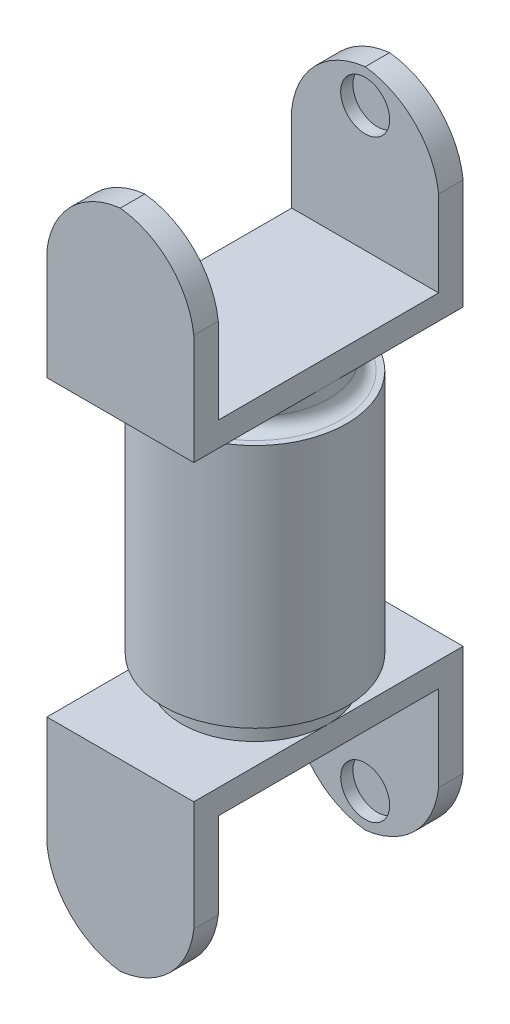
ISO-10303-21;
HEADER;
FILE_DESCRIPTION(('STEP AP214'),'2;1');
FILE_NAME('part.step','',(''),(''),'','','');
FILE_SCHEMA(('AUTOMOTIVE_DESIGN { 1 0 10303 214 1 1 1 1 }'));
ENDSEC;
DATA;
#1=APPLICATION_CONTEXT('core data for automotive mechanical design processes');
#2=APPLICATION_PROTOCOL_DEFINITION('international standard','automotive_design',2000,#1);
#3=PRODUCT_CONTEXT('',#1,'mechanical');
#4=PRODUCT('Part','Part','',(#3));
#5=PRODUCT_RELATED_PRODUCT_CATEGORY('part','',(#4));
#6=PRODUCT_DEFINITION_FORMATION('','',#4);
#7=PRODUCT_DEFINITION_CONTEXT('part definition',#1,'design');
#8=PRODUCT_DEFINITION('design','',#6,#7);
#9=PRODUCT_DEFINITION_SHAPE('','',#8);
#10=(LENGTH_UNIT() NAMED_UNIT(*) SI_UNIT(.MILLI.,.METRE.));
#11=(NAMED_UNIT(*) PLANE_ANGLE_UNIT() SI_UNIT($,.RADIAN.));
#12=(NAMED_UNIT(*) SI_UNIT($,.STERADIAN.) SOLID_ANGLE_UNIT());
#13=UNCERTAINTY_MEASURE_WITH_UNIT(LENGTH_MEASURE(1.E-05),#10,'distance_accuracy_value','');
#14=(GEOMETRIC_REPRESENTATION_CONTEXT(3) GLOBAL_UNCERTAINTY_ASSIGNED_CONTEXT((#13)) GLOBAL_UNIT_ASSIGNED_CONTEXT((#10,
#11,#12)) REPRESENTATION_CONTEXT('',''));
#15=CARTESIAN_POINT('',(0.,0.,0.));
#16=DIRECTION('',(0.,0.,1.));
#17=DIRECTION('',(1.,0.,0.));
#18=AXIS2_PLACEMENT_3D('',#15,#16,#17);
#19=CARTESIAN_POINT('',(-6.,-12.,-11.));
#20=DIRECTION('',(0.,0.,1.));
#21=DIRECTION('',(1.,0.,0.));
#22=AXIS2_PLACEMENT_3D('',#19,#20,#21);
#23=PLANE('',#22);
#24=CARTESIAN_POINT('',(-0.750000000000014,-20.25,-11.));
#25=DIRECTION('',(0.,0.,1.));
#26=DIRECTION('',(1.,0.,0.));
#27=AXIS2_PLACEMENT_3D('',#24,#25,#26);
#28=CIRCLE('',#27,6.79153885360307);
#29=CARTESIAN_POINT('',(0.,-27.,-11.));
#30=VERTEX_POINT('',#29);
#31=CARTESIAN_POINT('',(6.,-21.,-11.));
#32=VERTEX_POINT('',#31);
#33=EDGE_CURVE('E519',#30,#32,#28,.T.);
#34=ORIENTED_EDGE('',*,*,#33,.F.);
#35=CARTESIAN_POINT('',(0.750000000000014,-20.25,-11.));
#36=DIRECTION('',(0.,0.,1.));
#37=DIRECTION('',(1.,0.,0.));
#38=AXIS2_PLACEMENT_3D('',#35,#36,#37);
#39=CIRCLE('',#38,6.79153885360307);
#40=CARTESIAN_POINT('',(-6.,-21.,-11.));
#41=VERTEX_POINT('',#40);
#42=EDGE_CURVE('E502',#30,#41,#39,.F.);
#43=ORIENTED_EDGE('',*,*,#42,.T.);
#44=DIRECTION('',(0.,-1.,0.));
#45=VECTOR('',#44,1.);
#46=CARTESIAN_POINT('',(-6.,-12.,-11.));
#47=LINE('',#46,#45);
#48=CARTESIAN_POINT('',(-6.,-12.,-11.));
#49=VERTEX_POINT('',#48);
#50=EDGE_CURVE('E291',#49,#41,#47,.T.);
#51=ORIENTED_EDGE('',*,*,#50,.F.);
#52=DIRECTION('',(1.,0.,0.));
#53=VECTOR('',#52,1.);
#54=CARTESIAN_POINT('',(-6.,-12.,-11.));
#55=LINE('',#54,#53);
#56=CARTESIAN_POINT('',(6.,-12.,-11.));
#57=VERTEX_POINT('',#56);
#58=EDGE_CURVE('E296',#49,#57,#55,.T.);
#59=ORIENTED_EDGE('',*,*,#58,.T.);
#60=DIRECTION('',(0.,-1.,0.));
#61=VECTOR('',#60,1.);
#62=CARTESIAN_POINT('',(6.,-12.,-11.));
#63=LINE('',#62,#61);
#64=EDGE_CURVE('E269',#57,#32,#63,.T.);
#65=ORIENTED_EDGE('',*,*,#64,.T.);
#66=EDGE_LOOP('',(#34,#43,#51,#59,#65));
#67=FACE_BOUND('',#66,.T.);
#68=ADVANCED_FACE('F75',(#67),#23,.F.);
#69=CARTESIAN_POINT('',(-6.,-27.,-9.));
#70=DIRECTION('',(0.,0.,-1.));
#71=DIRECTION('',(-1.,0.,0.));
#72=AXIS2_PLACEMENT_3D('',#69,#70,#71);
#73=PLANE('',#72);
#74=CARTESIAN_POINT('',(0.,-24.25,-9.));
#75=DIRECTION('',(0.,0.,-1.));
#76=DIRECTION('',(-1.,0.,0.));
#77=AXIS2_PLACEMENT_3D('',#74,#75,#76);
#78=CIRCLE('',#77,2.);
#79=CARTESIAN_POINT('',(-2.,-24.25,-9.));
#80=VERTEX_POINT('',#79);
#81=EDGE_CURVE('E246',#80,#80,#78,.T.);
#82=ORIENTED_EDGE('',*,*,#81,.T.);
#83=EDGE_LOOP('',(#82));
#84=FACE_BOUND('',#83,.T.);
#85=CARTESIAN_POINT('',(-0.750000000000014,-20.25,-9.));
#86=DIRECTION('',(0.,0.,-1.));
#87=DIRECTION('',(-1.,0.,0.));
#88=AXIS2_PLACEMENT_3D('',#85,#86,#87);
#89=CIRCLE('',#88,6.79153885360307);
#90=CARTESIAN_POINT('',(6.,-21.,-9.));
#91=VERTEX_POINT('',#90);
#92=CARTESIAN_POINT('',(0.,-27.,-9.));
#93=VERTEX_POINT('',#92);
#94=EDGE_CURVE('E522',#91,#93,#89,.T.);
#95=ORIENTED_EDGE('',*,*,#94,.F.);
#96=DIRECTION('',(0.,1.,0.));
#97=VECTOR('',#96,1.);
#98=CARTESIAN_POINT('',(6.,-27.,-9.));
#99=LINE('',#98,#97);
#100=CARTESIAN_POINT('',(6.,-14.,-9.));
#101=VERTEX_POINT('',#100);
#102=EDGE_CURVE('E266',#91,#101,#99,.T.);
#103=ORIENTED_EDGE('',*,*,#102,.T.);
#104=DIRECTION('',(1.,0.,0.));
#105=VECTOR('',#104,1.);
#106=CARTESIAN_POINT('',(-6.,-14.,-9.));
#107=LINE('',#106,#105);
#108=CARTESIAN_POINT('',(-6.,-14.,-9.));
#109=VERTEX_POINT('',#108);
#110=EDGE_CURVE('E301',#109,#101,#107,.T.);
#111=ORIENTED_EDGE('',*,*,#110,.F.);
#112=DIRECTION('',(0.,1.,0.));
#113=VECTOR('',#112,1.);
#114=CARTESIAN_POINT('',(-6.,-27.,-9.));
#115=LINE('',#114,#113);
#116=CARTESIAN_POINT('',(-6.,-21.,-9.));
#117=VERTEX_POINT('',#116);
#118=EDGE_CURVE('E288',#117,#109,#115,.T.);
#119=ORIENTED_EDGE('',*,*,#118,.F.);
#120=CARTESIAN_POINT('',(0.750000000000014,-20.25,-9.));
#121=DIRECTION('',(0.,0.,-1.));
#122=DIRECTION('',(-1.,0.,0.));
#123=AXIS2_PLACEMENT_3D('',#120,#121,#122);
#124=CIRCLE('',#123,6.79153885360307);
#125=EDGE_CURVE('E100',#117,#93,#124,.F.);
#126=ORIENTED_EDGE('',*,*,#125,.T.);
#127=EDGE_LOOP('',(#95,#103,#111,#119,#126));
#128=FACE_BOUND('',#127,.T.);
#129=ADVANCED_FACE('F555',(#84,#128),#73,.F.);
#130=CARTESIAN_POINT('',(-6.,-14.,9.));
#131=DIRECTION('',(0.,0.,1.));
#132=DIRECTION('',(0.,-1.,0.));
#133=AXIS2_PLACEMENT_3D('',#130,#131,#132);
#134=PLANE('',#133);
#135=CARTESIAN_POINT('',(0.,-24.25,9.));
#136=DIRECTION('',(0.,0.,1.));
#137=DIRECTION('',(0.,-1.,0.));
#138=AXIS2_PLACEMENT_3D('',#135,#136,#137);
#139=CIRCLE('',#138,2.);
#140=CARTESIAN_POINT('',(0.,-26.25,9.));
#141=VERTEX_POINT('',#140);
#142=EDGE_CURVE('E79',#141,#141,#139,.T.);
#143=ORIENTED_EDGE('',*,*,#142,.T.);
#144=EDGE_LOOP('',(#143));
#145=FACE_BOUND('',#144,.T.);
#146=CARTESIAN_POINT('',(-0.750000000000014,-20.25,9.));
#147=DIRECTION('',(0.,0.,1.));
#148=DIRECTION('',(0.,-1.,0.));
#149=AXIS2_PLACEMENT_3D('',#146,#147,#148);
#150=CIRCLE('',#149,6.79153885360307);
#151=CARTESIAN_POINT('',(0.,-27.,9.));
#152=VERTEX_POINT('',#151);
#153=CARTESIAN_POINT('',(6.,-21.,9.));
#154=VERTEX_POINT('',#153);
#155=EDGE_CURVE('E231',#152,#154,#150,.T.);
#156=ORIENTED_EDGE('',*,*,#155,.F.);
#157=CARTESIAN_POINT('',(0.750000000000014,-20.25,9.));
#158=DIRECTION('',(0.,0.,1.));
#159=DIRECTION('',(0.,-1.,0.));
#160=AXIS2_PLACEMENT_3D('',#157,#158,#159);
#161=CIRCLE('',#160,6.79153885360307);
#162=CARTESIAN_POINT('',(-6.,-21.,9.));
#163=VERTEX_POINT('',#162);
#164=EDGE_CURVE('E507',#152,#163,#161,.F.);
#165=ORIENTED_EDGE('',*,*,#164,.T.);
#166=DIRECTION('',(0.,-1.,0.));
#167=VECTOR('',#166,1.);
#168=CARTESIAN_POINT('',(-6.,-14.,9.));
#169=LINE('',#168,#167);
#170=CARTESIAN_POINT('',(-6.,-14.,9.));
#171=VERTEX_POINT('',#170);
#172=EDGE_CURVE('E281',#171,#163,#169,.T.);
#173=ORIENTED_EDGE('',*,*,#172,.F.);
#174=DIRECTION('',(1.,0.,0.));
#175=VECTOR('',#174,1.);
#176=CARTESIAN_POINT('',(-6.,-14.,9.));
#177=LINE('',#176,#175);
#178=CARTESIAN_POINT('',(6.,-14.,9.));
#179=VERTEX_POINT('',#178);
#180=EDGE_CURVE('E305',#171,#179,#177,.T.);
#181=ORIENTED_EDGE('',*,*,#180,.T.);
#182=DIRECTION('',(0.,-1.,0.));
#183=VECTOR('',#182,1.);
#184=CARTESIAN_POINT('',(6.,-14.,9.));
#185=LINE('',#184,#183);
#186=EDGE_CURVE('E253',#179,#154,#185,.T.);
#187=ORIENTED_EDGE('',*,*,#186,.T.);
#188=EDGE_LOOP('',(#156,#165,#173,#181,#187));
#189=FACE_BOUND('',#188,.T.);
#190=ADVANCED_FACE('F560',(#145,#189),#134,.F.);
#191=CARTESIAN_POINT('',(-6.,-27.,11.));
#192=DIRECTION('',(0.,0.,-1.));
#193=DIRECTION('',(0.,1.,0.));
#194=AXIS2_PLACEMENT_3D('',#191,#192,#193);
#195=PLANE('',#194);
#196=CARTESIAN_POINT('',(-0.750000000000014,-20.25,11.));
#197=DIRECTION('',(0.,0.,-1.));
#198=DIRECTION('',(1.,0.,0.));
#199=AXIS2_PLACEMENT_3D('',#196,#197,#198);
#200=CIRCLE('',#199,6.79153885360307);
#201=CARTESIAN_POINT('',(0.,-27.,11.));
#202=VERTEX_POINT('',#201);
#203=CARTESIAN_POINT('',(6.,-21.,11.));
#204=VERTEX_POINT('',#203);
#205=EDGE_CURVE('E229',#202,#204,#200,.F.);
#206=ORIENTED_EDGE('',*,*,#205,.T.);
#207=DIRECTION('',(0.,1.,0.));
#208=VECTOR('',#207,1.);
#209=CARTESIAN_POINT('',(6.,-27.,11.));
#210=LINE('',#209,#208);
#211=CARTESIAN_POINT('',(6.,-12.,11.));
#212=VERTEX_POINT('',#211);
#213=EDGE_CURVE('E242',#204,#212,#210,.T.);
#214=ORIENTED_EDGE('',*,*,#213,.T.);
#215=DIRECTION('',(1.,0.,0.));
#216=VECTOR('',#215,1.);
#217=CARTESIAN_POINT('',(-6.,-12.,11.));
#218=LINE('',#217,#216);
#219=CARTESIAN_POINT('',(-6.,-12.,11.));
#220=VERTEX_POINT('',#219);
#221=EDGE_CURVE('E295',#220,#212,#218,.T.);
#222=ORIENTED_EDGE('',*,*,#221,.F.);
#223=DIRECTION('',(0.,1.,0.));
#224=VECTOR('',#223,1.);
#225=CARTESIAN_POINT('',(-6.,-27.,11.));
#226=LINE('',#225,#224);
#227=CARTESIAN_POINT('',(-6.,-21.,11.));
#228=VERTEX_POINT('',#227);
#229=EDGE_CURVE('E278',#228,#220,#226,.T.);
#230=ORIENTED_EDGE('',*,*,#229,.F.);
#231=CARTESIAN_POINT('',(0.750000000000014,-20.25,11.));
#232=DIRECTION('',(0.,0.,-1.));
#233=DIRECTION('',(1.,0.,0.));
#234=AXIS2_PLACEMENT_3D('',#231,#232,#233);
#235=CIRCLE('',#234,6.79153885360307);
#236=EDGE_CURVE('E92',#202,#228,#235,.T.);
#237=ORIENTED_EDGE('',*,*,#236,.F.);
#238=EDGE_LOOP('',(#206,#214,#222,#230,#237));
#239=FACE_BOUND('',#238,.T.);
#240=ADVANCED_FACE('F240',(#239),#195,.F.);
#241=CARTESIAN_POINT('',(6.,0.,0.));
#242=DIRECTION('',(1.,0.,0.));
#243=DIRECTION('',(0.,0.,-1.));
#244=AXIS2_PLACEMENT_3D('',#241,#242,#243);
#245=PLANE('',#244);
#246=ORIENTED_EDGE('',*,*,#213,.F.);
#247=DIRECTION('',(0.,0.,1.));
#248=VECTOR('',#247,1.);
#249=CARTESIAN_POINT('',(6.,-21.,-18.));
#250=LINE('',#249,#248);
#251=EDGE_CURVE('E226',#154,#204,#250,.T.);
#252=ORIENTED_EDGE('',*,*,#251,.F.);
#253=ORIENTED_EDGE('',*,*,#186,.F.);
#254=DIRECTION('',(0.,0.,1.));
#255=VECTOR('',#254,1.);
#256=CARTESIAN_POINT('',(6.,-14.,-9.));
#257=LINE('',#256,#255);
#258=EDGE_CURVE('E257',#101,#179,#257,.T.);
#259=ORIENTED_EDGE('',*,*,#258,.F.);
#260=ORIENTED_EDGE('',*,*,#102,.F.);
#261=EDGE_CURVE('E237',#32,#91,#250,.T.);
#262=ORIENTED_EDGE('',*,*,#261,.F.);
#263=ORIENTED_EDGE('',*,*,#64,.F.);
#264=DIRECTION('',(0.,0.,-1.));
#265=VECTOR('',#264,1.);
#266=CARTESIAN_POINT('',(6.,-12.,-6.));
#267=LINE('',#266,#265);
#268=CARTESIAN_POINT('',(6.,-12.,0.));
#269=VERTEX_POINT('',#268);
#270=EDGE_CURVE('E259',#269,#57,#267,.T.);
#271=ORIENTED_EDGE('',*,*,#270,.F.);
#272=EDGE_CURVE('E251',#212,#269,#267,.T.);
#273=ORIENTED_EDGE('',*,*,#272,.F.);
#274=EDGE_LOOP('',(#246,#252,#253,#259,#260,#262,#263,#271,#273));
#275=FACE_BOUND('',#274,.T.);
#276=ADVANCED_FACE('F249',(#275),#245,.T.);
#277=CARTESIAN_POINT('',(-6.,27.,11.));
#278=DIRECTION('',(0.,0.,1.));
#279=DIRECTION('',(0.,-1.,0.));
#280=AXIS2_PLACEMENT_3D('',#277,#278,#279);
#281=PLANE('',#280);
#282=CARTESIAN_POINT('',(-0.750000000000014,20.25,11.));
#283=DIRECTION('',(0.,0.,1.));
#284=DIRECTION('',(1.,0.,0.));
#285=AXIS2_PLACEMENT_3D('',#282,#283,#284);
#286=CIRCLE('',#285,6.79153885360307);
#287=CARTESIAN_POINT('',(0.,27.,11.));
#288=VERTEX_POINT('',#287);
#289=CARTESIAN_POINT('',(6.,21.,11.));
#290=VERTEX_POINT('',#289);
#291=EDGE_CURVE('E335',#288,#290,#286,.F.);
#292=ORIENTED_EDGE('',*,*,#291,.F.);
#293=CARTESIAN_POINT('',(0.750000000000014,20.25,11.));
#294=DIRECTION('',(0.,0.,1.));
#295=DIRECTION('',(1.,0.,0.));
#296=AXIS2_PLACEMENT_3D('',#293,#294,#295);
#297=CIRCLE('',#296,6.79153885360307);
#298=CARTESIAN_POINT('',(-6.,21.,11.));
#299=VERTEX_POINT('',#298);
#300=EDGE_CURVE('E352',#288,#299,#297,.T.);
#301=ORIENTED_EDGE('',*,*,#300,.T.);
#302=DIRECTION('',(0.,-1.,0.));
#303=VECTOR('',#302,1.);
#304=CARTESIAN_POINT('',(-6.,27.,11.));
#305=LINE('',#304,#303);
#306=CARTESIAN_POINT('',(-6.,12.,11.));
#307=VERTEX_POINT('',#306);
#308=EDGE_CURVE('E415',#299,#307,#305,.T.);
#309=ORIENTED_EDGE('',*,*,#308,.T.);
#310=DIRECTION('',(1.,0.,0.));
#311=VECTOR('',#310,1.);
#312=CARTESIAN_POINT('',(-6.,12.,11.));
#313=LINE('',#312,#311);
#314=CARTESIAN_POINT('',(6.,12.,11.));
#315=VERTEX_POINT('',#314);
#316=EDGE_CURVE('E419',#307,#315,#313,.T.);
#317=ORIENTED_EDGE('',*,*,#316,.T.);
#318=DIRECTION('',(0.,-1.,0.));
#319=VECTOR('',#318,1.);
#320=CARTESIAN_POINT('',(6.,27.,11.));
#321=LINE('',#320,#319);
#322=EDGE_CURVE('E392',#290,#315,#321,.T.);
#323=ORIENTED_EDGE('',*,*,#322,.F.);
#324=EDGE_LOOP('',(#292,#301,#309,#317,#323));
#325=FACE_BOUND('',#324,.T.);
#326=ADVANCED_FACE('F618',(#325),#281,.T.);
#327=CARTESIAN_POINT('',(-6.,14.,9.));
#328=DIRECTION('',(0.,0.,-1.));
#329=DIRECTION('',(0.,1.,0.));
#330=AXIS2_PLACEMENT_3D('',#327,#328,#329);
#331=PLANE('',#330);
#332=CARTESIAN_POINT('',(0.,24.25,9.));
#333=DIRECTION('',(0.,0.,-1.));
#334=DIRECTION('',(0.,1.,0.));
#335=AXIS2_PLACEMENT_3D('',#332,#333,#334);
#336=CIRCLE('',#335,2.);
#337=CARTESIAN_POINT('',(0.,26.25,9.));
#338=VERTEX_POINT('',#337);
#339=EDGE_CURVE('E331',#338,#338,#336,.F.);
#340=ORIENTED_EDGE('',*,*,#339,.T.);
#341=EDGE_LOOP('',(#340));
#342=FACE_BOUND('',#341,.T.);
#343=CARTESIAN_POINT('',(-0.750000000000014,20.25,9.));
#344=DIRECTION('',(0.,0.,-1.));
#345=DIRECTION('',(0.,1.,0.));
#346=AXIS2_PLACEMENT_3D('',#343,#344,#345);
#347=CIRCLE('',#346,6.79153885360307);
#348=CARTESIAN_POINT('',(6.,21.,9.));
#349=VERTEX_POINT('',#348);
#350=CARTESIAN_POINT('',(0.,27.,9.00000000000001));
#351=VERTEX_POINT('',#350);
#352=EDGE_CURVE('E349',#349,#351,#347,.F.);
#353=ORIENTED_EDGE('',*,*,#352,.F.);
#354=DIRECTION('',(0.,1.,0.));
#355=VECTOR('',#354,1.);
#356=CARTESIAN_POINT('',(6.,14.,9.));
#357=LINE('',#356,#355);
#358=CARTESIAN_POINT('',(6.,14.,9.));
#359=VERTEX_POINT('',#358);
#360=EDGE_CURVE('E388',#359,#349,#357,.T.);
#361=ORIENTED_EDGE('',*,*,#360,.F.);
#362=DIRECTION('',(1.,0.,0.));
#363=VECTOR('',#362,1.);
#364=CARTESIAN_POINT('',(-6.,14.,9.));
#365=LINE('',#364,#363);
#366=CARTESIAN_POINT('',(-6.,14.,9.));
#367=VERTEX_POINT('',#366);
#368=EDGE_CURVE('E424',#367,#359,#365,.T.);
#369=ORIENTED_EDGE('',*,*,#368,.F.);
#370=DIRECTION('',(0.,1.,0.));
#371=VECTOR('',#370,1.);
#372=CARTESIAN_POINT('',(-6.,14.,9.));
#373=LINE('',#372,#371);
#374=CARTESIAN_POINT('',(-6.,21.,9.));
#375=VERTEX_POINT('',#374);
#376=EDGE_CURVE('E411',#367,#375,#373,.T.);
#377=ORIENTED_EDGE('',*,*,#376,.T.);
#378=CARTESIAN_POINT('',(0.750000000000014,20.25,9.));
#379=DIRECTION('',(0.,0.,-1.));
#380=DIRECTION('',(0.,1.,0.));
#381=AXIS2_PLACEMENT_3D('',#378,#379,#380);
#382=CIRCLE('',#381,6.79153885360307);
#383=EDGE_CURVE('E368',#375,#351,#382,.T.);
#384=ORIENTED_EDGE('',*,*,#383,.T.);
#385=EDGE_LOOP('',(#353,#361,#369,#377,#384));
#386=FACE_BOUND('',#385,.T.);
#387=ADVANCED_FACE('F621',(#342,#386),#331,.T.);
#388=CARTESIAN_POINT('',(-6.,27.,-9.));
#389=DIRECTION('',(0.,0.,1.));
#390=DIRECTION('',(1.,0.,0.));
#391=AXIS2_PLACEMENT_3D('',#388,#389,#390);
#392=PLANE('',#391);
#393=CARTESIAN_POINT('',(0.,24.25,-9.));
#394=DIRECTION('',(0.,0.,1.));
#395=DIRECTION('',(1.,0.,0.));
#396=AXIS2_PLACEMENT_3D('',#393,#394,#395);
#397=CIRCLE('',#396,2.);
#398=CARTESIAN_POINT('',(2.,24.25,-9.));
#399=VERTEX_POINT('',#398);
#400=EDGE_CURVE('E330',#399,#399,#397,.F.);
#401=ORIENTED_EDGE('',*,*,#400,.T.);
#402=EDGE_LOOP('',(#401));
#403=FACE_BOUND('',#402,.T.);
#404=CARTESIAN_POINT('',(-0.750000000000014,20.25,-9.));
#405=DIRECTION('',(0.,0.,1.));
#406=DIRECTION('',(1.,0.,0.));
#407=AXIS2_PLACEMENT_3D('',#404,#405,#406);
#408=CIRCLE('',#407,6.79153885360307);
#409=CARTESIAN_POINT('',(0.,27.,-9.));
#410=VERTEX_POINT('',#409);
#411=CARTESIAN_POINT('',(6.,21.,-9.));
#412=VERTEX_POINT('',#411);
#413=EDGE_CURVE('E346',#410,#412,#408,.F.);
#414=ORIENTED_EDGE('',*,*,#413,.F.);
#415=CARTESIAN_POINT('',(0.750000000000014,20.25,-9.));
#416=DIRECTION('',(0.,0.,1.));
#417=DIRECTION('',(1.,0.,0.));
#418=AXIS2_PLACEMENT_3D('',#415,#416,#417);
#419=CIRCLE('',#418,6.79153885360307);
#420=CARTESIAN_POINT('',(-6.,21.,-9.));
#421=VERTEX_POINT('',#420);
#422=EDGE_CURVE('E364',#410,#421,#419,.T.);
#423=ORIENTED_EDGE('',*,*,#422,.T.);
#424=DIRECTION('',(0.,-1.,0.));
#425=VECTOR('',#424,1.);
#426=CARTESIAN_POINT('',(-6.,27.,-9.));
#427=LINE('',#426,#425);
#428=CARTESIAN_POINT('',(-6.,14.,-9.));
#429=VERTEX_POINT('',#428);
#430=EDGE_CURVE('E404',#421,#429,#427,.T.);
#431=ORIENTED_EDGE('',*,*,#430,.T.);
#432=DIRECTION('',(1.,0.,0.));
#433=VECTOR('',#432,1.);
#434=CARTESIAN_POINT('',(-6.,14.,-9.));
#435=LINE('',#434,#433);
#436=CARTESIAN_POINT('',(6.,14.,-9.));
#437=VERTEX_POINT('',#436);
#438=EDGE_CURVE('E427',#429,#437,#435,.T.);
#439=ORIENTED_EDGE('',*,*,#438,.T.);
#440=DIRECTION('',(0.,-1.,0.));
#441=VECTOR('',#440,1.);
#442=CARTESIAN_POINT('',(6.,27.,-9.));
#443=LINE('',#442,#441);
#444=EDGE_CURVE('E381',#412,#437,#443,.T.);
#445=ORIENTED_EDGE('',*,*,#444,.F.);
#446=EDGE_LOOP('',(#414,#423,#431,#439,#445));
#447=FACE_BOUND('',#446,.T.);
#448=ADVANCED_FACE('F469',(#403,#447),#392,.T.);
#449=CARTESIAN_POINT('',(-6.,12.,-11.));
#450=DIRECTION('',(0.,0.,-1.));
#451=DIRECTION('',(-1.,0.,0.));
#452=AXIS2_PLACEMENT_3D('',#449,#450,#451);
#453=PLANE('',#452);
#454=CARTESIAN_POINT('',(-0.750000000000014,20.25,-11.));
#455=DIRECTION('',(0.,0.,-1.));
#456=DIRECTION('',(-1.,0.,0.));
#457=AXIS2_PLACEMENT_3D('',#454,#455,#456);
#458=CIRCLE('',#457,6.79153885360307);
#459=CARTESIAN_POINT('',(6.,21.,-11.));
#460=VERTEX_POINT('',#459);
#461=CARTESIAN_POINT('',(0.,27.,-11.));
#462=VERTEX_POINT('',#461);
#463=EDGE_CURVE('E343',#460,#462,#458,.F.);
#464=ORIENTED_EDGE('',*,*,#463,.F.);
#465=DIRECTION('',(0.,1.,0.));
#466=VECTOR('',#465,1.);
#467=CARTESIAN_POINT('',(6.,12.,-11.));
#468=LINE('',#467,#466);
#469=CARTESIAN_POINT('',(6.,12.,-11.));
#470=VERTEX_POINT('',#469);
#471=EDGE_CURVE('E377',#470,#460,#468,.T.);
#472=ORIENTED_EDGE('',*,*,#471,.F.);
#473=DIRECTION('',(1.,0.,0.));
#474=VECTOR('',#473,1.);
#475=CARTESIAN_POINT('',(-6.,12.,-11.));
#476=LINE('',#475,#474);
#477=CARTESIAN_POINT('',(-6.,12.,-11.));
#478=VERTEX_POINT('',#477);
#479=EDGE_CURVE('E418',#478,#470,#476,.T.);
#480=ORIENTED_EDGE('',*,*,#479,.F.);
#481=DIRECTION('',(0.,1.,0.));
#482=VECTOR('',#481,1.);
#483=CARTESIAN_POINT('',(-6.,12.,-11.));
#484=LINE('',#483,#482);
#485=CARTESIAN_POINT('',(-6.,21.,-11.));
#486=VERTEX_POINT('',#485);
#487=EDGE_CURVE('E400',#478,#486,#484,.T.);
#488=ORIENTED_EDGE('',*,*,#487,.T.);
#489=CARTESIAN_POINT('',(0.750000000000014,20.25,-11.));
#490=DIRECTION('',(0.,0.,-1.));
#491=DIRECTION('',(-1.,0.,0.));
#492=AXIS2_PLACEMENT_3D('',#489,#490,#491);
#493=CIRCLE('',#492,6.79153885360307);
#494=EDGE_CURVE('E360',#486,#462,#493,.T.);
#495=ORIENTED_EDGE('',*,*,#494,.T.);
#496=EDGE_LOOP('',(#464,#472,#480,#488,#495));
#497=FACE_BOUND('',#496,.T.);
#498=ADVANCED_FACE('F612',(#497),#453,.T.);
#499=CARTESIAN_POINT('',(-6.,0.,0.));
#500=DIRECTION('',(1.,0.,0.));
#501=DIRECTION('',(0.,0.,-1.));
#502=AXIS2_PLACEMENT_3D('',#499,#500,#501);
#503=PLANE('',#502);
#504=DIRECTION('',(0.,0.,1.));
#505=VECTOR('',#504,1.);
#506=CARTESIAN_POINT('',(-6.,21.,-18.));
#507=LINE('',#506,#505);
#508=EDGE_CURVE('E453',#486,#421,#507,.T.);
#509=ORIENTED_EDGE('',*,*,#508,.F.);
#510=ORIENTED_EDGE('',*,*,#487,.F.);
#511=DIRECTION('',(0.,0.,-1.));
#512=VECTOR('',#511,1.);
#513=CARTESIAN_POINT('',(-6.,12.,-6.));
#514=LINE('',#513,#512);
#515=CARTESIAN_POINT('',(-6.,12.,0.));
#516=VERTEX_POINT('',#515);
#517=EDGE_CURVE('E395',#516,#478,#514,.T.);
#518=ORIENTED_EDGE('',*,*,#517,.F.);
#519=EDGE_CURVE('E396',#307,#516,#514,.T.);
#520=ORIENTED_EDGE('',*,*,#519,.F.);
#521=ORIENTED_EDGE('',*,*,#308,.F.);
#522=EDGE_CURVE('E450',#375,#299,#507,.T.);
#523=ORIENTED_EDGE('',*,*,#522,.F.);
#524=ORIENTED_EDGE('',*,*,#376,.F.);
#525=DIRECTION('',(0.,0.,1.));
#526=VECTOR('',#525,1.);
#527=CARTESIAN_POINT('',(-6.,14.,-9.));
#528=LINE('',#527,#526);
#529=EDGE_CURVE('E407',#429,#367,#528,.T.);
#530=ORIENTED_EDGE('',*,*,#529,.F.);
#531=ORIENTED_EDGE('',*,*,#430,.F.);
#532=EDGE_LOOP('',(#509,#510,#518,#520,#521,#523,#524,#530,#531));
#533=FACE_BOUND('',#532,.T.);
#534=ADVANCED_FACE('F473',(#533),#503,.F.);
#535=CARTESIAN_POINT('',(0.,10.,0.));
#536=DIRECTION('',(0.,-1.,0.));
#537=DIRECTION('',(0.,0.,-1.));
#538=AXIS2_PLACEMENT_3D('',#535,#536,#537);
#539=CYLINDRICAL_SURFACE('',#538,7.5);
#540=CARTESIAN_POINT('',(0.,10.,0.));
#541=DIRECTION('',(0.,1.,0.));
#542=DIRECTION('',(0.,0.,1.));
#543=AXIS2_PLACEMENT_3D('',#540,#541,#542);
#544=CIRCLE('',#543,7.5);
#545=CARTESIAN_POINT('',(0.,10.,7.5));
#546=VERTEX_POINT('',#545);
#547=EDGE_CURVE('E438',#546,#546,#544,.T.);
#548=ORIENTED_EDGE('',*,*,#547,.F.);
#549=EDGE_LOOP('',(#548));
#550=FACE_BOUND('',#549,.T.);
#551=CARTESIAN_POINT('',(0.,-10.,0.));
#552=DIRECTION('',(0.,1.,0.));
#553=DIRECTION('',(0.,0.,1.));
#554=AXIS2_PLACEMENT_3D('',#551,#552,#553);
#555=CIRCLE('',#554,7.5);
#556=CARTESIAN_POINT('',(0.,-10.,7.5));
#557=VERTEX_POINT('',#556);
#558=EDGE_CURVE('E314',#557,#557,#555,.T.);
#559=ORIENTED_EDGE('',*,*,#558,.T.);
#560=EDGE_LOOP('',(#559));
#561=FACE_BOUND('',#560,.T.);
#562=ADVANCED_FACE('F611',(#550,#561),#539,.T.);
#563=CARTESIAN_POINT('',(0.,10.,0.));
#564=DIRECTION('',(0.,1.,0.));
#565=DIRECTION('',(0.,0.,1.));
#566=AXIS2_PLACEMENT_3D('',#563,#564,#565);
#567=PLANE('',#566);
#568=CARTESIAN_POINT('',(0.,10.,0.));
#569=DIRECTION('',(0.,1.,0.));
#570=DIRECTION('',(0.,0.,1.));
#571=AXIS2_PLACEMENT_3D('',#568,#569,#570);
#572=CIRCLE('',#571,7.);
#573=CARTESIAN_POINT('',(0.,10.,7.));
#574=VERTEX_POINT('',#573);
#575=EDGE_CURVE('E446',#574,#574,#572,.F.);
#576=ORIENTED_EDGE('',*,*,#575,.T.);
#577=EDGE_LOOP('',(#576));
#578=FACE_BOUND('',#577,.T.);
#579=ORIENTED_EDGE('',*,*,#547,.T.);
#580=EDGE_LOOP('',(#579));
#581=FACE_BOUND('',#580,.T.);
#582=ADVANCED_FACE('F637',(#578,#581),#567,.T.);
#583=CARTESIAN_POINT('',(0.,12.,0.));
#584=DIRECTION('',(0.,-1.,0.));
#585=DIRECTION('',(0.,0.,-1.));
#586=AXIS2_PLACEMENT_3D('',#583,#584,#585);
#587=CYLINDRICAL_SURFACE('',#586,6.);
#588=CARTESIAN_POINT('',(0.,11.,0.));
#589=DIRECTION('',(0.,1.,0.));
#590=DIRECTION('',(0.,0.,1.));
#591=AXIS2_PLACEMENT_3D('',#588,#589,#590);
#592=CIRCLE('',#591,6.);
#593=CARTESIAN_POINT('',(0.,11.,6.));
#594=VERTEX_POINT('',#593);
#595=EDGE_CURVE('E442',#594,#594,#592,.T.);
#596=ORIENTED_EDGE('',*,*,#595,.T.);
#597=EDGE_LOOP('',(#596));
#598=FACE_BOUND('',#597,.T.);
#599=CARTESIAN_POINT('',(0.,12.,0.));
#600=DIRECTION('',(0.,1.,0.));
#601=DIRECTION('',(0.,0.,1.));
#602=AXIS2_PLACEMENT_3D('',#599,#600,#601);
#603=CIRCLE('',#602,6.);
#604=CARTESIAN_POINT('',(6.,12.,0.));
#605=VERTEX_POINT('',#604);
#606=EDGE_CURVE('E434',#605,#516,#603,.T.);
#607=ORIENTED_EDGE('',*,*,#606,.F.);
#608=EDGE_CURVE('E423',#516,#605,#603,.T.);
#609=ORIENTED_EDGE('',*,*,#608,.F.);
#610=EDGE_LOOP('',(#607,#609));
#611=FACE_BOUND('',#610,.T.);
#612=ADVANCED_FACE('F634',(#598,#611),#587,.T.);
#613=CARTESIAN_POINT('',(0.,11.,0.));
#614=DIRECTION('',(0.,1.,0.));
#615=DIRECTION('',(0.,0.,1.));
#616=AXIS2_PLACEMENT_3D('',#613,#614,#615);
#617=TOROIDAL_SURFACE('',#616,7.,1.);
#618=ORIENTED_EDGE('',*,*,#575,.F.);
#619=EDGE_LOOP('',(#618));
#620=FACE_BOUND('',#619,.T.);
#621=ORIENTED_EDGE('',*,*,#595,.F.);
#622=EDGE_LOOP('',(#621));
#623=FACE_BOUND('',#622,.T.);
#624=ADVANCED_FACE('F77',(#620,#623),#617,.F.);
#625=CARTESIAN_POINT('',(-6.,12.,-6.));
#626=DIRECTION('',(0.,-1.,0.));
#627=DIRECTION('',(0.,0.,-1.));
#628=AXIS2_PLACEMENT_3D('',#625,#626,#627);
#629=PLANE('',#628);
#630=DIRECTION('',(0.,0.,-1.));
#631=VECTOR('',#630,1.);
#632=CARTESIAN_POINT('',(6.,12.,-6.));
#633=LINE('',#632,#631);
#634=EDGE_CURVE('E372',#605,#470,#633,.T.);
#635=ORIENTED_EDGE('',*,*,#634,.F.);
#636=ORIENTED_EDGE('',*,*,#606,.T.);
#637=ORIENTED_EDGE('',*,*,#517,.T.);
#638=ORIENTED_EDGE('',*,*,#479,.T.);
#639=EDGE_LOOP('',(#635,#636,#637,#638));
#640=FACE_BOUND('',#639,.T.);
#641=ADVANCED_FACE('F616',(#640),#629,.T.);
#642=ORIENTED_EDGE('',*,*,#519,.T.);
#643=ORIENTED_EDGE('',*,*,#608,.T.);
#644=EDGE_CURVE('E373',#315,#605,#633,.T.);
#645=ORIENTED_EDGE('',*,*,#644,.F.);
#646=ORIENTED_EDGE('',*,*,#316,.F.);
#647=EDGE_LOOP('',(#642,#643,#645,#646));
#648=FACE_BOUND('',#647,.T.);
#649=ADVANCED_FACE('F613',(#648),#629,.T.);
#650=CARTESIAN_POINT('',(-6.,14.,-9.));
#651=DIRECTION('',(0.,1.,0.));
#652=DIRECTION('',(0.,0.,1.));
#653=AXIS2_PLACEMENT_3D('',#650,#651,#652);
#654=PLANE('',#653);
#655=ORIENTED_EDGE('',*,*,#368,.T.);
#656=DIRECTION('',(0.,0.,1.));
#657=VECTOR('',#656,1.);
#658=CARTESIAN_POINT('',(6.,14.,-9.));
#659=LINE('',#658,#657);
#660=EDGE_CURVE('E384',#437,#359,#659,.T.);
#661=ORIENTED_EDGE('',*,*,#660,.F.);
#662=ORIENTED_EDGE('',*,*,#438,.F.);
#663=ORIENTED_EDGE('',*,*,#529,.T.);
#664=EDGE_LOOP('',(#655,#661,#662,#663));
#665=FACE_BOUND('',#664,.T.);
#666=ADVANCED_FACE('F477',(#665),#654,.T.);
#667=CARTESIAN_POINT('',(6.,0.,0.));
#668=DIRECTION('',(1.,0.,0.));
#669=DIRECTION('',(0.,0.,-1.));
#670=AXIS2_PLACEMENT_3D('',#667,#668,#669);
#671=PLANE('',#670);
#672=DIRECTION('',(0.,0.,1.));
#673=VECTOR('',#672,1.);
#674=CARTESIAN_POINT('',(6.,21.,-18.));
#675=LINE('',#674,#673);
#676=EDGE_CURVE('E338',#349,#290,#675,.T.);
#677=ORIENTED_EDGE('',*,*,#676,.T.);
#678=ORIENTED_EDGE('',*,*,#322,.T.);
#679=ORIENTED_EDGE('',*,*,#644,.T.);
#680=ORIENTED_EDGE('',*,*,#634,.T.);
#681=ORIENTED_EDGE('',*,*,#471,.T.);
#682=EDGE_CURVE('E342',#460,#412,#675,.T.);
#683=ORIENTED_EDGE('',*,*,#682,.T.);
#684=ORIENTED_EDGE('',*,*,#444,.T.);
#685=ORIENTED_EDGE('',*,*,#660,.T.);
#686=ORIENTED_EDGE('',*,*,#360,.T.);
#687=EDGE_LOOP('',(#677,#678,#679,#680,#681,#683,#684,#685,#686));
#688=FACE_BOUND('',#687,.T.);
#689=ADVANCED_FACE('F481',(#688),#671,.T.);
#690=CARTESIAN_POINT('',(0.750000000000014,20.25,-18.));
#691=DIRECTION('',(0.,0.,1.));
#692=DIRECTION('',(1.,0.,0.));
#693=AXIS2_PLACEMENT_3D('',#690,#691,#692);
#694=CYLINDRICAL_SURFACE('',#693,6.79153885360307);
#695=ORIENTED_EDGE('',*,*,#522,.T.);
#696=ORIENTED_EDGE('',*,*,#300,.F.);
#697=DIRECTION('',(0.,0.,1.));
#698=VECTOR('',#697,1.);
#699=CARTESIAN_POINT('',(0.,27.,-18.));
#700=LINE('',#699,#698);
#701=EDGE_CURVE('E356',#351,#288,#700,.T.);
#702=ORIENTED_EDGE('',*,*,#701,.F.);
#703=ORIENTED_EDGE('',*,*,#383,.F.);
#704=EDGE_LOOP('',(#695,#696,#702,#703));
#705=FACE_BOUND('',#704,.T.);
#706=ADVANCED_FACE('F606',(#705),#694,.T.);
#707=EDGE_CURVE('E359',#462,#410,#700,.T.);
#708=ORIENTED_EDGE('',*,*,#707,.F.);
#709=ORIENTED_EDGE('',*,*,#494,.F.);
#710=ORIENTED_EDGE('',*,*,#508,.T.);
#711=ORIENTED_EDGE('',*,*,#422,.F.);
#712=EDGE_LOOP('',(#708,#709,#710,#711));
#713=FACE_BOUND('',#712,.T.);
#714=ADVANCED_FACE('F463',(#713),#694,.T.);
#715=CARTESIAN_POINT('',(-0.750000000000014,20.25,-18.));
#716=DIRECTION('',(0.,0.,1.));
#717=DIRECTION('',(1.,0.,0.));
#718=AXIS2_PLACEMENT_3D('',#715,#716,#717);
#719=CYLINDRICAL_SURFACE('',#718,6.79153885360307);
#720=ORIENTED_EDGE('',*,*,#413,.T.);
#721=ORIENTED_EDGE('',*,*,#682,.F.);
#722=ORIENTED_EDGE('',*,*,#463,.T.);
#723=ORIENTED_EDGE('',*,*,#707,.T.);
#724=EDGE_LOOP('',(#720,#721,#722,#723));
#725=FACE_BOUND('',#724,.T.);
#726=ADVANCED_FACE('F601',(#725),#719,.T.);
#727=ORIENTED_EDGE('',*,*,#352,.T.);
#728=ORIENTED_EDGE('',*,*,#701,.T.);
#729=ORIENTED_EDGE('',*,*,#291,.T.);
#730=ORIENTED_EDGE('',*,*,#676,.F.);
#731=EDGE_LOOP('',(#727,#728,#729,#730));
#732=FACE_BOUND('',#731,.T.);
#733=ADVANCED_FACE('F596',(#732),#719,.T.);
#734=CARTESIAN_POINT('',(0.,24.25,-10.));
#735=DIRECTION('',(0.,0.,-1.));
#736=DIRECTION('',(0.,1.,0.));
#737=AXIS2_PLACEMENT_3D('',#734,#735,#736);
#738=PLANE('',#737);
#739=CARTESIAN_POINT('',(0.,24.25,-10.));
#740=DIRECTION('',(0.,0.,-1.));
#741=DIRECTION('',(0.,1.,0.));
#742=AXIS2_PLACEMENT_3D('',#739,#740,#741);
#743=CIRCLE('',#742,2.);
#744=CARTESIAN_POINT('',(0.,26.25,-10.));
#745=VERTEX_POINT('',#744);
#746=EDGE_CURVE('E326',#745,#745,#743,.T.);
#747=ORIENTED_EDGE('',*,*,#746,.F.);
#748=EDGE_LOOP('',(#747));
#749=FACE_BOUND('',#748,.T.);
#750=ADVANCED_FACE('F592',(#749),#738,.F.);
#751=CARTESIAN_POINT('',(0.,24.25,-10.));
#752=DIRECTION('',(0.,0.,1.));
#753=DIRECTION('',(0.,-1.,0.));
#754=AXIS2_PLACEMENT_3D('',#751,#752,#753);
#755=CYLINDRICAL_SURFACE('',#754,2.);
#756=ORIENTED_EDGE('',*,*,#400,.F.);
#757=EDGE_LOOP('',(#756));
#758=FACE_BOUND('',#757,.T.);
#759=ORIENTED_EDGE('',*,*,#746,.T.);
#760=EDGE_LOOP('',(#759));
#761=FACE_BOUND('',#760,.T.);
#762=ADVANCED_FACE('F595',(#758,#761),#755,.F.);
#763=ORIENTED_EDGE('',*,*,#339,.F.);
#764=EDGE_LOOP('',(#763));
#765=FACE_BOUND('',#764,.T.);
#766=CARTESIAN_POINT('',(0.,24.25,10.));
#767=DIRECTION('',(0.,0.,-1.));
#768=DIRECTION('',(0.,1.,0.));
#769=AXIS2_PLACEMENT_3D('',#766,#767,#768);
#770=CIRCLE('',#769,2.);
#771=CARTESIAN_POINT('',(0.,26.25,10.));
#772=VERTEX_POINT('',#771);
#773=EDGE_CURVE('E322',#772,#772,#770,.T.);
#774=ORIENTED_EDGE('',*,*,#773,.F.);
#775=EDGE_LOOP('',(#774));
#776=FACE_BOUND('',#775,.T.);
#777=ADVANCED_FACE('F590',(#765,#776),#755,.F.);
#778=CARTESIAN_POINT('',(0.,24.25,10.));
#779=DIRECTION('',(0.,0.,-1.));
#780=DIRECTION('',(0.,1.,0.));
#781=AXIS2_PLACEMENT_3D('',#778,#779,#780);
#782=PLANE('',#781);
#783=ORIENTED_EDGE('',*,*,#773,.T.);
#784=EDGE_LOOP('',(#783));
#785=FACE_BOUND('',#784,.T.);
#786=ADVANCED_FACE('F586',(#785),#782,.T.);
#787=CARTESIAN_POINT('',(0.,-10.,0.));
#788=DIRECTION('',(0.,-1.,0.));
#789=DIRECTION('',(0.,0.,1.));
#790=AXIS2_PLACEMENT_3D('',#787,#788,#789);
#791=PLANE('',#790);
#792=CARTESIAN_POINT('',(0.,-10.,0.));
#793=DIRECTION('',(0.,1.,0.));
#794=DIRECTION('',(0.,0.,1.));
#795=AXIS2_PLACEMENT_3D('',#792,#793,#794);
#796=CIRCLE('',#795,6.);
#797=CARTESIAN_POINT('',(0.,-10.,6.));
#798=VERTEX_POINT('',#797);
#799=EDGE_CURVE('E300',#798,#798,#796,.T.);
#800=ORIENTED_EDGE('',*,*,#799,.T.);
#801=EDGE_LOOP('',(#800));
#802=FACE_BOUND('',#801,.T.);
#803=ORIENTED_EDGE('',*,*,#558,.F.);
#804=EDGE_LOOP('',(#803));
#805=FACE_BOUND('',#804,.T.);
#806=ADVANCED_FACE('F582',(#802,#805),#791,.T.);
#807=CARTESIAN_POINT('',(0.,-12.,0.));
#808=DIRECTION('',(0.,1.,0.));
#809=DIRECTION('',(0.,0.,1.));
#810=AXIS2_PLACEMENT_3D('',#807,#808,#809);
#811=CYLINDRICAL_SURFACE('',#810,6.);
#812=CARTESIAN_POINT('',(0.,-12.,0.));
#813=DIRECTION('',(0.,1.,0.));
#814=DIRECTION('',(0.,0.,1.));
#815=AXIS2_PLACEMENT_3D('',#812,#813,#814);
#816=CIRCLE('',#815,6.);
#817=CARTESIAN_POINT('',(-6.,-12.,0.));
#818=VERTEX_POINT('',#817);
#819=EDGE_CURVE('E310',#269,#818,#816,.T.);
#820=ORIENTED_EDGE('',*,*,#819,.T.);
#821=EDGE_CURVE('E315',#818,#269,#816,.T.);
#822=ORIENTED_EDGE('',*,*,#821,.T.);
#823=EDGE_LOOP('',(#820,#822));
#824=FACE_BOUND('',#823,.T.);
#825=ORIENTED_EDGE('',*,*,#799,.F.);
#826=EDGE_LOOP('',(#825));
#827=FACE_BOUND('',#826,.T.);
#828=ADVANCED_FACE('F579',(#824,#827),#811,.T.);
#829=CARTESIAN_POINT('',(-6.,-12.,11.));
#830=DIRECTION('',(0.,-1.,0.));
#831=DIRECTION('',(0.,0.,-1.));
#832=AXIS2_PLACEMENT_3D('',#829,#830,#831);
#833=PLANE('',#832);
#834=ORIENTED_EDGE('',*,*,#819,.F.);
#835=ORIENTED_EDGE('',*,*,#270,.T.);
#836=ORIENTED_EDGE('',*,*,#58,.F.);
#837=DIRECTION('',(0.,0.,-1.));
#838=VECTOR('',#837,1.);
#839=CARTESIAN_POINT('',(-6.,-12.,-6.));
#840=LINE('',#839,#838);
#841=EDGE_CURVE('E273',#818,#49,#840,.T.);
#842=ORIENTED_EDGE('',*,*,#841,.F.);
#843=EDGE_LOOP('',(#834,#835,#836,#842));
#844=FACE_BOUND('',#843,.T.);
#845=ADVANCED_FACE('F503',(#844),#833,.F.);
#846=CARTESIAN_POINT('',(-6.,-14.,-9.));
#847=DIRECTION('',(0.,1.,0.));
#848=DIRECTION('',(0.,0.,1.));
#849=AXIS2_PLACEMENT_3D('',#846,#847,#848);
#850=PLANE('',#849);
#851=ORIENTED_EDGE('',*,*,#110,.T.);
#852=ORIENTED_EDGE('',*,*,#258,.T.);
#853=ORIENTED_EDGE('',*,*,#180,.F.);
#854=DIRECTION('',(0.,0.,1.));
#855=VECTOR('',#854,1.);
#856=CARTESIAN_POINT('',(-6.,-14.,-9.));
#857=LINE('',#856,#855);
#858=EDGE_CURVE('E285',#109,#171,#857,.T.);
#859=ORIENTED_EDGE('',*,*,#858,.F.);
#860=EDGE_LOOP('',(#851,#852,#853,#859));
#861=FACE_BOUND('',#860,.T.);
#862=ADVANCED_FACE('F566',(#861),#850,.F.);
#863=ORIENTED_EDGE('',*,*,#821,.F.);
#864=EDGE_CURVE('E274',#220,#818,#840,.T.);
#865=ORIENTED_EDGE('',*,*,#864,.F.);
#866=ORIENTED_EDGE('',*,*,#221,.T.);
#867=ORIENTED_EDGE('',*,*,#272,.T.);
#868=EDGE_LOOP('',(#863,#865,#866,#867));
#869=FACE_BOUND('',#868,.T.);
#870=ADVANCED_FACE('F569',(#869),#833,.F.);
#871=CARTESIAN_POINT('',(-6.,0.,0.));
#872=DIRECTION('',(1.,0.,0.));
#873=DIRECTION('',(0.,0.,-1.));
#874=AXIS2_PLACEMENT_3D('',#871,#872,#873);
#875=PLANE('',#874);
#876=ORIENTED_EDGE('',*,*,#50,.T.);
#877=DIRECTION('',(0.,0.,1.));
#878=VECTOR('',#877,1.);
#879=CARTESIAN_POINT('',(-6.,-21.,-18.));
#880=LINE('',#879,#878);
#881=EDGE_CURVE('E12',#41,#117,#880,.T.);
#882=ORIENTED_EDGE('',*,*,#881,.T.);
#883=ORIENTED_EDGE('',*,*,#118,.T.);
#884=ORIENTED_EDGE('',*,*,#858,.T.);
#885=ORIENTED_EDGE('',*,*,#172,.T.);
#886=EDGE_CURVE('E85',#163,#228,#880,.T.);
#887=ORIENTED_EDGE('',*,*,#886,.T.);
#888=ORIENTED_EDGE('',*,*,#229,.T.);
#889=ORIENTED_EDGE('',*,*,#864,.T.);
#890=ORIENTED_EDGE('',*,*,#841,.T.);
#891=EDGE_LOOP('',(#876,#882,#883,#884,#885,#887,#888,#889,#890));
#892=FACE_BOUND('',#891,.T.);
#893=ADVANCED_FACE('F492',(#892),#875,.F.);
#894=CARTESIAN_POINT('',(0.750000000000014,-20.25,-18.));
#895=DIRECTION('',(0.,0.,1.));
#896=DIRECTION('',(1.,0.,0.));
#897=AXIS2_PLACEMENT_3D('',#894,#895,#896);
#898=CYLINDRICAL_SURFACE('',#897,6.79153885360307);
#899=DIRECTION('',(0.,0.,1.));
#900=VECTOR('',#899,1.);
#901=CARTESIAN_POINT('',(0.,-27.,-18.));
#902=LINE('',#901,#900);
#903=EDGE_CURVE('E514',#152,#202,#902,.T.);
#904=ORIENTED_EDGE('',*,*,#903,.T.);
#905=ORIENTED_EDGE('',*,*,#236,.T.);
#906=ORIENTED_EDGE('',*,*,#886,.F.);
#907=ORIENTED_EDGE('',*,*,#164,.F.);
#908=EDGE_LOOP('',(#904,#905,#906,#907));
#909=FACE_BOUND('',#908,.T.);
#910=ADVANCED_FACE('F752',(#909),#898,.T.);
#911=EDGE_CURVE('E513',#30,#93,#902,.T.);
#912=ORIENTED_EDGE('',*,*,#911,.T.);
#913=ORIENTED_EDGE('',*,*,#125,.F.);
#914=ORIENTED_EDGE('',*,*,#881,.F.);
#915=ORIENTED_EDGE('',*,*,#42,.F.);
#916=EDGE_LOOP('',(#912,#913,#914,#915));
#917=FACE_BOUND('',#916,.T.);
#918=ADVANCED_FACE('F759',(#917),#898,.T.);
#919=CARTESIAN_POINT('',(-0.750000000000014,-20.25,-18.));
#920=DIRECTION('',(0.,0.,1.));
#921=DIRECTION('',(1.,0.,0.));
#922=AXIS2_PLACEMENT_3D('',#919,#920,#921);
#923=CYLINDRICAL_SURFACE('',#922,6.79153885360307);
#924=ORIENTED_EDGE('',*,*,#33,.T.);
#925=ORIENTED_EDGE('',*,*,#261,.T.);
#926=ORIENTED_EDGE('',*,*,#94,.T.);
#927=ORIENTED_EDGE('',*,*,#911,.F.);
#928=EDGE_LOOP('',(#924,#925,#926,#927));
#929=FACE_BOUND('',#928,.T.);
#930=ADVANCED_FACE('F551',(#929),#923,.T.);
#931=ORIENTED_EDGE('',*,*,#155,.T.);
#932=ORIENTED_EDGE('',*,*,#251,.T.);
#933=ORIENTED_EDGE('',*,*,#205,.F.);
#934=ORIENTED_EDGE('',*,*,#903,.F.);
#935=EDGE_LOOP('',(#931,#932,#933,#934));
#936=FACE_BOUND('',#935,.T.);
#937=ADVANCED_FACE('F228',(#936),#923,.T.);
#938=CARTESIAN_POINT('',(0.,-24.25,10.));
#939=DIRECTION('',(0.,0.,-1.));
#940=DIRECTION('',(0.,-1.,0.));
#941=AXIS2_PLACEMENT_3D('',#938,#939,#940);
#942=PLANE('',#941);
#943=CARTESIAN_POINT('',(0.,-24.25,10.));
#944=DIRECTION('',(0.,0.,1.));
#945=DIRECTION('',(0.,-1.,0.));
#946=AXIS2_PLACEMENT_3D('',#943,#944,#945);
#947=CIRCLE('',#946,2.);
#948=CARTESIAN_POINT('',(0.,-26.25,10.));
#949=VERTEX_POINT('',#948);
#950=EDGE_CURVE('E534',#949,#949,#947,.T.);
#951=ORIENTED_EDGE('',*,*,#950,.F.);
#952=EDGE_LOOP('',(#951));
#953=FACE_BOUND('',#952,.T.);
#954=ADVANCED_FACE('F542',(#953),#942,.T.);
#955=CARTESIAN_POINT('',(0.,-24.25,-10.));
#956=DIRECTION('',(0.,0.,1.));
#957=DIRECTION('',(0.,-1.,0.));
#958=AXIS2_PLACEMENT_3D('',#955,#956,#957);
#959=CYLINDRICAL_SURFACE('',#958,2.);
#960=ORIENTED_EDGE('',*,*,#950,.T.);
#961=EDGE_LOOP('',(#960));
#962=FACE_BOUND('',#961,.T.);
#963=ORIENTED_EDGE('',*,*,#142,.F.);
#964=EDGE_LOOP('',(#963));
#965=FACE_BOUND('',#964,.T.);
#966=ADVANCED_FACE('F539',(#962,#965),#959,.F.);
#967=CARTESIAN_POINT('',(0.,-24.25,-10.));
#968=DIRECTION('',(0.,0.,1.));
#969=DIRECTION('',(0.,-1.,0.));
#970=AXIS2_PLACEMENT_3D('',#967,#968,#969);
#971=CIRCLE('',#970,2.);
#972=CARTESIAN_POINT('',(0.,-26.25,-10.));
#973=VERTEX_POINT('',#972);
#974=EDGE_CURVE('E530',#973,#973,#971,.T.);
#975=ORIENTED_EDGE('',*,*,#974,.F.);
#976=EDGE_LOOP('',(#975));
#977=FACE_BOUND('',#976,.T.);
#978=ORIENTED_EDGE('',*,*,#81,.F.);
#979=EDGE_LOOP('',(#978));
#980=FACE_BOUND('',#979,.T.);
#981=ADVANCED_FACE('F549',(#977,#980),#959,.F.);
#982=CARTESIAN_POINT('',(0.,-24.25,-10.));
#983=DIRECTION('',(0.,0.,-1.));
#984=DIRECTION('',(0.,-1.,0.));
#985=AXIS2_PLACEMENT_3D('',#982,#983,#984);
#986=PLANE('',#985);
#987=ORIENTED_EDGE('',*,*,#974,.T.);
#988=EDGE_LOOP('',(#987));
#989=FACE_BOUND('',#988,.T.);
#990=ADVANCED_FACE('F794',(#989),#986,.F.);
#991=CLOSED_SHELL('',(#68,#129,#190,#240,#276,#326,#387,#448,#498,#534,#562,#582,#612,#624,#641,
#649,#666,#689,#706,#714,#726,#733,#750,#762,#777,#786,#806,#828,#845,#862,#870,#893,#910,#918,
#930,#937,#954,#966,#981,#990));
#992=MANIFOLD_SOLID_BREP('B2',#991);
#993=ADVANCED_BREP_SHAPE_REPRESENTATION('',(#18,#992),#14);
#994=SHAPE_DEFINITION_REPRESENTATION(#9,#993);
ENDSEC;
END-ISO-10303-21;
